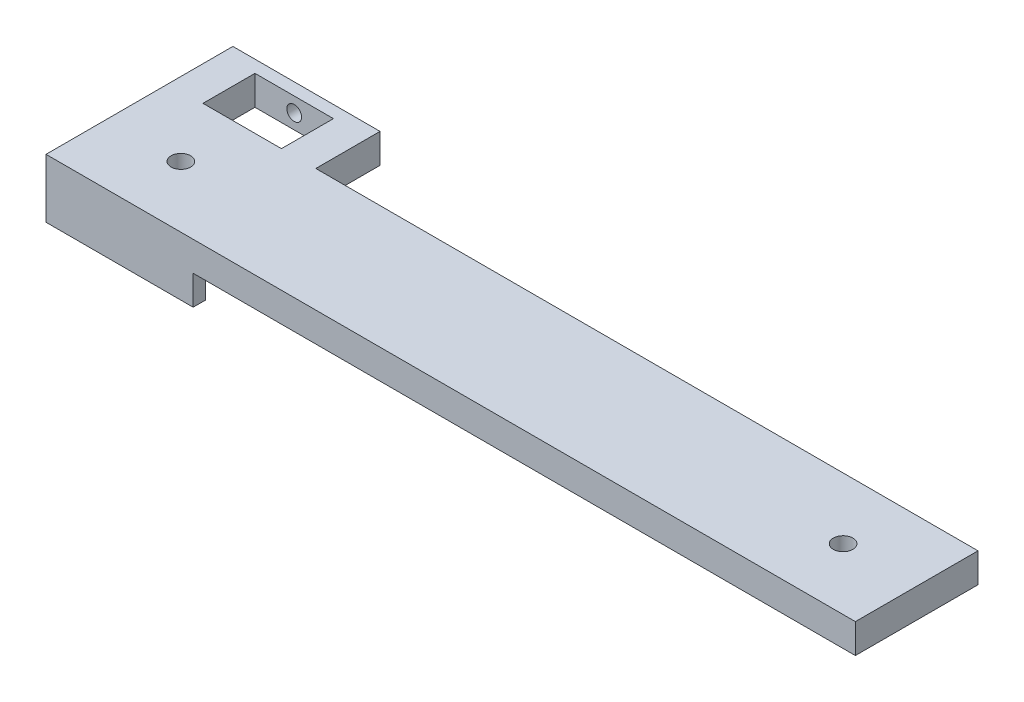
ISO-10303-21;
HEADER;
FILE_DESCRIPTION(('STEP AP214'),'2;1');
FILE_NAME('part.step','',(''),(''),'','','');
FILE_SCHEMA(('AUTOMOTIVE_DESIGN { 1 0 10303 214 1 1 1 1 }'));
ENDSEC;
DATA;
#1=APPLICATION_CONTEXT('core data for automotive mechanical design processes');
#2=APPLICATION_PROTOCOL_DEFINITION('international standard','automotive_design',2000,#1);
#3=PRODUCT_CONTEXT('',#1,'mechanical');
#4=PRODUCT('Part','Part','',(#3));
#5=PRODUCT_RELATED_PRODUCT_CATEGORY('part','',(#4));
#6=PRODUCT_DEFINITION_FORMATION('','',#4);
#7=PRODUCT_DEFINITION_CONTEXT('part definition',#1,'design');
#8=PRODUCT_DEFINITION('design','',#6,#7);
#9=PRODUCT_DEFINITION_SHAPE('','',#8);
#10=(LENGTH_UNIT() NAMED_UNIT(*) SI_UNIT(.MILLI.,.METRE.));
#11=(NAMED_UNIT(*) PLANE_ANGLE_UNIT() SI_UNIT($,.RADIAN.));
#12=(NAMED_UNIT(*) SI_UNIT($,.STERADIAN.) SOLID_ANGLE_UNIT());
#13=UNCERTAINTY_MEASURE_WITH_UNIT(LENGTH_MEASURE(1.E-05),#10,'distance_accuracy_value','');
#14=(GEOMETRIC_REPRESENTATION_CONTEXT(3) GLOBAL_UNCERTAINTY_ASSIGNED_CONTEXT((#13)) GLOBAL_UNIT_ASSIGNED_CONTEXT((#10,
#11,#12)) REPRESENTATION_CONTEXT('',''));
#15=CARTESIAN_POINT('',(0.,0.,0.));
#16=DIRECTION('',(0.,0.,1.));
#17=DIRECTION('',(1.,0.,0.));
#18=AXIS2_PLACEMENT_3D('',#15,#16,#17);
#19=CARTESIAN_POINT('',(0.,-6.,0.));
#20=DIRECTION('',(0.,-1.,0.));
#21=DIRECTION('',(0.,0.,1.));
#22=AXIS2_PLACEMENT_3D('',#19,#20,#21);
#23=PLANE('',#22);
#24=DIRECTION('',(-1.,0.,0.));
#25=VECTOR('',#24,1.);
#26=CARTESIAN_POINT('',(0.,-6.,-2.5));
#27=LINE('',#26,#25);
#28=CARTESIAN_POINT('',(-23.,-6.,-2.5));
#29=VERTEX_POINT('',#28);
#30=CARTESIAN_POINT('',(-30.,-6.,-2.5));
#31=VERTEX_POINT('',#30);
#32=EDGE_CURVE('E193',#29,#31,#27,.T.);
#33=ORIENTED_EDGE('',*,*,#32,.T.);
#34=DIRECTION('',(0.,0.,-1.));
#35=VECTOR('',#34,1.);
#36=CARTESIAN_POINT('',(-30.,-6.,0.));
#37=LINE('',#36,#35);
#38=CARTESIAN_POINT('',(-30.,-6.,-15.6));
#39=VERTEX_POINT('',#38);
#40=EDGE_CURVE('E181',#31,#39,#37,.T.);
#41=ORIENTED_EDGE('',*,*,#40,.T.);
#42=DIRECTION('',(-1.,0.,0.));
#43=VECTOR('',#42,1.);
#44=CARTESIAN_POINT('',(0.,-6.,-15.6));
#45=LINE('',#44,#43);
#46=CARTESIAN_POINT('',(0.,-6.,-15.6));
#47=VERTEX_POINT('',#46);
#48=EDGE_CURVE('E218',#47,#39,#45,.T.);
#49=ORIENTED_EDGE('',*,*,#48,.F.);
#50=DIRECTION('',(0.,0.,1.));
#51=VECTOR('',#50,1.);
#52=CARTESIAN_POINT('',(0.,-6.,0.));
#53=LINE('',#52,#51);
#54=CARTESIAN_POINT('',(0.,-6.,-2.5));
#55=VERTEX_POINT('',#54);
#56=EDGE_CURVE('E234',#47,#55,#53,.T.);
#57=ORIENTED_EDGE('',*,*,#56,.T.);
#58=CARTESIAN_POINT('',(-7.,-6.,-2.5));
#59=VERTEX_POINT('',#58);
#60=EDGE_CURVE('E195',#55,#59,#27,.T.);
#61=ORIENTED_EDGE('',*,*,#60,.T.);
#62=DIRECTION('',(0.,0.,-1.));
#63=VECTOR('',#62,1.);
#64=CARTESIAN_POINT('',(-7.,-6.,0.));
#65=LINE('',#64,#63);
#66=CARTESIAN_POINT('',(-7.,-6.,-13.1));
#67=VERTEX_POINT('',#66);
#68=EDGE_CURVE('E243',#59,#67,#65,.T.);
#69=ORIENTED_EDGE('',*,*,#68,.T.);
#70=DIRECTION('',(1.,0.,0.));
#71=VECTOR('',#70,1.);
#72=CARTESIAN_POINT('',(0.,-6.,-13.1));
#73=LINE('',#72,#71);
#74=CARTESIAN_POINT('',(-23.,-6.,-13.1));
#75=VERTEX_POINT('',#74);
#76=EDGE_CURVE('E240',#75,#67,#73,.T.);
#77=ORIENTED_EDGE('',*,*,#76,.F.);
#78=DIRECTION('',(0.,0.,-1.));
#79=VECTOR('',#78,1.);
#80=CARTESIAN_POINT('',(-23.,-6.,0.));
#81=LINE('',#80,#79);
#82=EDGE_CURVE('E237',#29,#75,#81,.T.);
#83=ORIENTED_EDGE('',*,*,#82,.F.);
#84=EDGE_LOOP('',(#33,#41,#49,#57,#61,#69,#77,#83));
#85=FACE_BOUND('',#84,.T.);
#86=ADVANCED_FACE('F37',(#85),#23,.T.);
#87=CARTESIAN_POINT('',(-23.,-6.,0.));
#88=DIRECTION('',(-1.,0.,0.));
#89=DIRECTION('',(0.,0.,1.));
#90=AXIS2_PLACEMENT_3D('',#87,#88,#89);
#91=PLANE('',#90);
#92=DIRECTION('',(0.,0.,-1.));
#93=VECTOR('',#92,1.);
#94=CARTESIAN_POINT('',(-23.,0.,0.));
#95=LINE('',#94,#93);
#96=CARTESIAN_POINT('',(-23.,0.,-2.5));
#97=VERTEX_POINT('',#96);
#98=CARTESIAN_POINT('',(-23.,0.,-13.1));
#99=VERTEX_POINT('',#98);
#100=EDGE_CURVE('E264',#97,#99,#95,.T.);
#101=ORIENTED_EDGE('',*,*,#100,.F.);
#102=DIRECTION('',(0.,1.,0.));
#103=VECTOR('',#102,1.);
#104=CARTESIAN_POINT('',(-23.,-6.,-2.5));
#105=LINE('',#104,#103);
#106=EDGE_CURVE('E276',#29,#97,#105,.T.);
#107=ORIENTED_EDGE('',*,*,#106,.F.);
#108=ORIENTED_EDGE('',*,*,#82,.T.);
#109=DIRECTION('',(0.,1.,0.));
#110=VECTOR('',#109,1.);
#111=CARTESIAN_POINT('',(-23.,-6.,-13.1));
#112=LINE('',#111,#110);
#113=EDGE_CURVE('E11',#75,#99,#112,.T.);
#114=ORIENTED_EDGE('',*,*,#113,.T.);
#115=EDGE_LOOP('',(#101,#107,#108,#114));
#116=FACE_BOUND('',#115,.T.);
#117=ADVANCED_FACE('F317',(#116),#91,.F.);
#118=CARTESIAN_POINT('',(0.,-6.,-13.1));
#119=DIRECTION('',(0.,0.,-1.));
#120=DIRECTION('',(-1.,0.,0.));
#121=AXIS2_PLACEMENT_3D('',#118,#119,#120);
#122=PLANE('',#121);
#123=CARTESIAN_POINT('',(-15.,-3.,-13.1));
#124=DIRECTION('',(0.,0.,1.));
#125=DIRECTION('',(-1.,0.,0.));
#126=AXIS2_PLACEMENT_3D('',#123,#124,#125);
#127=CIRCLE('',#126,1.5);
#128=CARTESIAN_POINT('',(-16.5,-3.,-13.1));
#129=VERTEX_POINT('',#128);
#130=EDGE_CURVE('E169',#129,#129,#127,.T.);
#131=ORIENTED_EDGE('',*,*,#130,.F.);
#132=EDGE_LOOP('',(#131));
#133=FACE_BOUND('',#132,.T.);
#134=DIRECTION('',(1.,0.,0.));
#135=VECTOR('',#134,1.);
#136=CARTESIAN_POINT('',(0.,0.,-13.1));
#137=LINE('',#136,#135);
#138=CARTESIAN_POINT('',(-7.,0.,-13.1));
#139=VERTEX_POINT('',#138);
#140=EDGE_CURVE('E267',#99,#139,#137,.T.);
#141=ORIENTED_EDGE('',*,*,#140,.F.);
#142=ORIENTED_EDGE('',*,*,#113,.F.);
#143=ORIENTED_EDGE('',*,*,#76,.T.);
#144=DIRECTION('',(0.,1.,0.));
#145=VECTOR('',#144,1.);
#146=CARTESIAN_POINT('',(-7.,-6.,-13.1));
#147=LINE('',#146,#145);
#148=EDGE_CURVE('E46',#67,#139,#147,.T.);
#149=ORIENTED_EDGE('',*,*,#148,.T.);
#150=EDGE_LOOP('',(#141,#142,#143,#149));
#151=FACE_BOUND('',#150,.T.);
#152=ADVANCED_FACE('F324',(#133,#151),#122,.F.);
#153=CARTESIAN_POINT('',(-7.,-6.,0.));
#154=DIRECTION('',(-1.,0.,0.));
#155=DIRECTION('',(0.,0.,1.));
#156=AXIS2_PLACEMENT_3D('',#153,#154,#155);
#157=PLANE('',#156);
#158=DIRECTION('',(0.,0.,-1.));
#159=VECTOR('',#158,1.);
#160=CARTESIAN_POINT('',(-7.,0.,0.));
#161=LINE('',#160,#159);
#162=CARTESIAN_POINT('',(-7.,0.,-2.5));
#163=VERTEX_POINT('',#162);
#164=EDGE_CURVE('E270',#163,#139,#161,.T.);
#165=ORIENTED_EDGE('',*,*,#164,.T.);
#166=ORIENTED_EDGE('',*,*,#148,.F.);
#167=ORIENTED_EDGE('',*,*,#68,.F.);
#168=DIRECTION('',(0.,1.,0.));
#169=VECTOR('',#168,1.);
#170=CARTESIAN_POINT('',(-7.,-6.,-2.5));
#171=LINE('',#170,#169);
#172=EDGE_CURVE('E279',#59,#163,#171,.T.);
#173=ORIENTED_EDGE('',*,*,#172,.T.);
#174=EDGE_LOOP('',(#165,#166,#167,#173));
#175=FACE_BOUND('',#174,.T.);
#176=ADVANCED_FACE('F321',(#175),#157,.T.);
#177=CARTESIAN_POINT('',(0.,-6.,-15.6));
#178=DIRECTION('',(0.,0.,1.));
#179=DIRECTION('',(1.,0.,0.));
#180=AXIS2_PLACEMENT_3D('',#177,#178,#179);
#181=PLANE('',#180);
#182=CARTESIAN_POINT('',(-15.,-3.,-15.6));
#183=DIRECTION('',(0.,0.,1.));
#184=DIRECTION('',(-1.,0.,0.));
#185=AXIS2_PLACEMENT_3D('',#182,#183,#184);
#186=CIRCLE('',#185,1.5);
#187=CARTESIAN_POINT('',(-16.5,-3.,-15.6));
#188=VERTEX_POINT('',#187);
#189=EDGE_CURVE('E417',#188,#188,#186,.T.);
#190=ORIENTED_EDGE('',*,*,#189,.T.);
#191=EDGE_LOOP('',(#190));
#192=FACE_BOUND('',#191,.T.);
#193=DIRECTION('',(-1.,0.,0.));
#194=VECTOR('',#193,1.);
#195=CARTESIAN_POINT('',(0.,0.,-15.6));
#196=LINE('',#195,#194);
#197=CARTESIAN_POINT('',(0.,0.,-15.6));
#198=VERTEX_POINT('',#197);
#199=CARTESIAN_POINT('',(-30.,0.,-15.6));
#200=VERTEX_POINT('',#199);
#201=EDGE_CURVE('E217',#198,#200,#196,.T.);
#202=ORIENTED_EDGE('',*,*,#201,.F.);
#203=DIRECTION('',(0.,1.,0.));
#204=VECTOR('',#203,1.);
#205=CARTESIAN_POINT('',(0.,-6.,-15.6));
#206=LINE('',#205,#204);
#207=EDGE_CURVE('E249',#47,#198,#206,.T.);
#208=ORIENTED_EDGE('',*,*,#207,.F.);
#209=ORIENTED_EDGE('',*,*,#48,.T.);
#210=DIRECTION('',(0.,1.,0.));
#211=VECTOR('',#210,1.);
#212=CARTESIAN_POINT('',(-30.,-6.,-15.6));
#213=LINE('',#212,#211);
#214=EDGE_CURVE('E280',#39,#200,#213,.T.);
#215=ORIENTED_EDGE('',*,*,#214,.T.);
#216=EDGE_LOOP('',(#202,#208,#209,#215));
#217=FACE_BOUND('',#216,.T.);
#218=ADVANCED_FACE('F39',(#192,#217),#181,.F.);
#219=CARTESIAN_POINT('',(-30.,-6.,0.));
#220=DIRECTION('',(-1.,0.,0.));
#221=DIRECTION('',(0.,0.,1.));
#222=AXIS2_PLACEMENT_3D('',#219,#220,#221);
#223=PLANE('',#222);
#224=CARTESIAN_POINT('',(-30.,-6.,20.));
#225=VERTEX_POINT('',#224);
#226=CARTESIAN_POINT('',(-30.,-6.,0.));
#227=VERTEX_POINT('',#226);
#228=EDGE_CURVE('E222',#225,#227,#37,.T.);
#229=ORIENTED_EDGE('',*,*,#228,.F.);
#230=DIRECTION('',(0.,1.,0.));
#231=VECTOR('',#230,1.);
#232=CARTESIAN_POINT('',(-30.,-12.,20.));
#233=LINE('',#232,#231);
#234=CARTESIAN_POINT('',(-30.,-12.,20.));
#235=VERTEX_POINT('',#234);
#236=EDGE_CURVE('E205',#235,#225,#233,.T.);
#237=ORIENTED_EDGE('',*,*,#236,.F.);
#238=DIRECTION('',(0.,0.,-1.));
#239=VECTOR('',#238,1.);
#240=CARTESIAN_POINT('',(-30.,-12.,0.));
#241=LINE('',#240,#239);
#242=CARTESIAN_POINT('',(-30.,-12.,22.5));
#243=VERTEX_POINT('',#242);
#244=EDGE_CURVE('E196',#243,#235,#241,.T.);
#245=ORIENTED_EDGE('',*,*,#244,.F.);
#246=DIRECTION('',(0.,1.,0.));
#247=VECTOR('',#246,1.);
#248=CARTESIAN_POINT('',(-30.,-6.,22.5));
#249=LINE('',#248,#247);
#250=CARTESIAN_POINT('',(-30.,0.,22.5));
#251=VERTEX_POINT('',#250);
#252=EDGE_CURVE('E296',#243,#251,#249,.T.);
#253=ORIENTED_EDGE('',*,*,#252,.T.);
#254=DIRECTION('',(0.,0.,-1.));
#255=VECTOR('',#254,1.);
#256=CARTESIAN_POINT('',(-30.,0.,0.));
#257=LINE('',#256,#255);
#258=EDGE_CURVE('E252',#251,#200,#257,.T.);
#259=ORIENTED_EDGE('',*,*,#258,.T.);
#260=ORIENTED_EDGE('',*,*,#214,.F.);
#261=ORIENTED_EDGE('',*,*,#40,.F.);
#262=DIRECTION('',(0.,1.,0.));
#263=VECTOR('',#262,1.);
#264=CARTESIAN_POINT('',(-30.,-12.,-2.5));
#265=LINE('',#264,#263);
#266=CARTESIAN_POINT('',(-30.,-12.,-2.5));
#267=VERTEX_POINT('',#266);
#268=EDGE_CURVE('E162',#267,#31,#265,.T.);
#269=ORIENTED_EDGE('',*,*,#268,.F.);
#270=DIRECTION('',(0.,0.,-1.));
#271=VECTOR('',#270,1.);
#272=CARTESIAN_POINT('',(-30.,-12.,0.));
#273=LINE('',#272,#271);
#274=CARTESIAN_POINT('',(-30.,-12.,0.));
#275=VERTEX_POINT('',#274);
#276=EDGE_CURVE('E168',#275,#267,#273,.T.);
#277=ORIENTED_EDGE('',*,*,#276,.F.);
#278=DIRECTION('',(0.,1.,0.));
#279=VECTOR('',#278,1.);
#280=CARTESIAN_POINT('',(-30.,-12.,0.));
#281=LINE('',#280,#279);
#282=EDGE_CURVE('E184',#275,#227,#281,.T.);
#283=ORIENTED_EDGE('',*,*,#282,.T.);
#284=EDGE_LOOP('',(#229,#237,#245,#253,#259,#260,#261,#269,#277,#283));
#285=FACE_BOUND('',#284,.T.);
#286=ADVANCED_FACE('F179',(#285),#223,.T.);
#287=CARTESIAN_POINT('',(0.,-6.,22.5));
#288=DIRECTION('',(0.,0.,1.));
#289=DIRECTION('',(1.,0.,0.));
#290=AXIS2_PLACEMENT_3D('',#287,#288,#289);
#291=PLANE('',#290);
#292=DIRECTION('',(-1.,0.,0.));
#293=VECTOR('',#292,1.);
#294=CARTESIAN_POINT('',(0.,-6.,22.5));
#295=LINE('',#294,#293);
#296=CARTESIAN_POINT('',(135.,-6.,22.4999999999999));
#297=VERTEX_POINT('',#296);
#298=CARTESIAN_POINT('',(0.,-6.,22.5));
#299=VERTEX_POINT('',#298);
#300=EDGE_CURVE('E225',#297,#299,#295,.T.);
#301=ORIENTED_EDGE('',*,*,#300,.F.);
#302=DIRECTION('',(0.,1.,0.));
#303=VECTOR('',#302,1.);
#304=CARTESIAN_POINT('',(135.,-6.,22.4999999999999));
#305=LINE('',#304,#303);
#306=CARTESIAN_POINT('',(135.,0.,22.4999999999999));
#307=VERTEX_POINT('',#306);
#308=EDGE_CURVE('E293',#297,#307,#305,.T.);
#309=ORIENTED_EDGE('',*,*,#308,.T.);
#310=DIRECTION('',(-1.,0.,0.));
#311=VECTOR('',#310,1.);
#312=CARTESIAN_POINT('',(0.,0.,22.5));
#313=LINE('',#312,#311);
#314=EDGE_CURVE('E254',#307,#251,#313,.T.);
#315=ORIENTED_EDGE('',*,*,#314,.T.);
#316=ORIENTED_EDGE('',*,*,#252,.F.);
#317=DIRECTION('',(-1.,0.,0.));
#318=VECTOR('',#317,1.);
#319=CARTESIAN_POINT('',(0.,-12.,22.5));
#320=LINE('',#319,#318);
#321=CARTESIAN_POINT('',(0.,-12.,22.5));
#322=VERTEX_POINT('',#321);
#323=EDGE_CURVE('E199',#322,#243,#320,.T.);
#324=ORIENTED_EDGE('',*,*,#323,.F.);
#325=DIRECTION('',(0.,1.,0.));
#326=VECTOR('',#325,1.);
#327=CARTESIAN_POINT('',(0.,-12.,22.5));
#328=LINE('',#327,#326);
#329=EDGE_CURVE('E209',#322,#299,#328,.T.);
#330=ORIENTED_EDGE('',*,*,#329,.T.);
#331=EDGE_LOOP('',(#301,#309,#315,#316,#324,#330));
#332=FACE_BOUND('',#331,.T.);
#333=ADVANCED_FACE('F373',(#332),#291,.T.);
#334=CARTESIAN_POINT('',(135.,-6.,0.));
#335=DIRECTION('',(-1.,0.,0.));
#336=DIRECTION('',(0.,0.,1.));
#337=AXIS2_PLACEMENT_3D('',#334,#335,#336);
#338=PLANE('',#337);
#339=DIRECTION('',(0.,0.,-1.));
#340=VECTOR('',#339,1.);
#341=CARTESIAN_POINT('',(135.,0.,0.));
#342=LINE('',#341,#340);
#343=CARTESIAN_POINT('',(135.,0.,-2.50000000000008));
#344=VERTEX_POINT('',#343);
#345=EDGE_CURVE('E256',#307,#344,#342,.T.);
#346=ORIENTED_EDGE('',*,*,#345,.F.);
#347=ORIENTED_EDGE('',*,*,#308,.F.);
#348=DIRECTION('',(0.,0.,-1.));
#349=VECTOR('',#348,1.);
#350=CARTESIAN_POINT('',(135.,-6.,0.));
#351=LINE('',#350,#349);
#352=CARTESIAN_POINT('',(135.,-6.,-2.50000000000008));
#353=VERTEX_POINT('',#352);
#354=EDGE_CURVE('E228',#297,#353,#351,.T.);
#355=ORIENTED_EDGE('',*,*,#354,.T.);
#356=DIRECTION('',(0.,1.,0.));
#357=VECTOR('',#356,1.);
#358=CARTESIAN_POINT('',(135.,-6.,-2.50000000000008));
#359=LINE('',#358,#357);
#360=EDGE_CURVE('E290',#353,#344,#359,.T.);
#361=ORIENTED_EDGE('',*,*,#360,.T.);
#362=EDGE_LOOP('',(#346,#347,#355,#361));
#363=FACE_BOUND('',#362,.T.);
#364=ADVANCED_FACE('F376',(#363),#338,.F.);
#365=CARTESIAN_POINT('',(0.,-6.,-2.5));
#366=DIRECTION('',(0.,0.,1.));
#367=DIRECTION('',(1.,0.,0.));
#368=AXIS2_PLACEMENT_3D('',#365,#366,#367);
#369=PLANE('',#368);
#370=DIRECTION('',(-1.,0.,0.));
#371=VECTOR('',#370,1.);
#372=CARTESIAN_POINT('',(0.,0.,-2.5));
#373=LINE('',#372,#371);
#374=CARTESIAN_POINT('',(0.,0.,-2.5));
#375=VERTEX_POINT('',#374);
#376=EDGE_CURVE('E259',#344,#375,#373,.T.);
#377=ORIENTED_EDGE('',*,*,#376,.F.);
#378=ORIENTED_EDGE('',*,*,#360,.F.);
#379=DIRECTION('',(-1.,0.,0.));
#380=VECTOR('',#379,1.);
#381=CARTESIAN_POINT('',(0.,-6.,-2.5));
#382=LINE('',#381,#380);
#383=EDGE_CURVE('E231',#353,#55,#382,.T.);
#384=ORIENTED_EDGE('',*,*,#383,.T.);
#385=DIRECTION('',(0.,1.,0.));
#386=VECTOR('',#385,1.);
#387=CARTESIAN_POINT('',(0.,-6.,-2.5));
#388=LINE('',#387,#386);
#389=EDGE_CURVE('E287',#55,#375,#388,.T.);
#390=ORIENTED_EDGE('',*,*,#389,.T.);
#391=EDGE_LOOP('',(#377,#378,#384,#390));
#392=FACE_BOUND('',#391,.T.);
#393=ADVANCED_FACE('F379',(#392),#369,.F.);
#394=CARTESIAN_POINT('',(0.,-6.,-2.5));
#395=DIRECTION('',(0.,0.,-1.));
#396=DIRECTION('',(-1.,0.,0.));
#397=AXIS2_PLACEMENT_3D('',#394,#395,#396);
#398=PLANE('',#397);
#399=CARTESIAN_POINT('',(-15.,-3.,-2.5));
#400=DIRECTION('',(0.,0.,1.));
#401=DIRECTION('',(-1.,0.,0.));
#402=AXIS2_PLACEMENT_3D('',#399,#400,#401);
#403=CIRCLE('',#402,1.5);
#404=CARTESIAN_POINT('',(-16.5,-3.,-2.5));
#405=VERTEX_POINT('',#404);
#406=EDGE_CURVE('E41',#405,#405,#403,.T.);
#407=ORIENTED_EDGE('',*,*,#406,.T.);
#408=EDGE_LOOP('',(#407));
#409=FACE_BOUND('',#408,.T.);
#410=DIRECTION('',(1.,0.,0.));
#411=VECTOR('',#410,1.);
#412=CARTESIAN_POINT('',(0.,0.,-2.5));
#413=LINE('',#412,#411);
#414=EDGE_CURVE('E272',#97,#163,#413,.T.);
#415=ORIENTED_EDGE('',*,*,#414,.T.);
#416=ORIENTED_EDGE('',*,*,#172,.F.);
#417=ORIENTED_EDGE('',*,*,#60,.F.);
#418=DIRECTION('',(0.,1.,0.));
#419=VECTOR('',#418,1.);
#420=CARTESIAN_POINT('',(0.,-12.,-2.5));
#421=LINE('',#420,#419);
#422=CARTESIAN_POINT('',(0.,-12.,-2.5));
#423=VERTEX_POINT('',#422);
#424=EDGE_CURVE('E166',#423,#55,#421,.T.);
#425=ORIENTED_EDGE('',*,*,#424,.F.);
#426=DIRECTION('',(1.,0.,0.));
#427=VECTOR('',#426,1.);
#428=CARTESIAN_POINT('',(0.,-12.,-2.5));
#429=LINE('',#428,#427);
#430=EDGE_CURVE('E157',#267,#423,#429,.T.);
#431=ORIENTED_EDGE('',*,*,#430,.F.);
#432=ORIENTED_EDGE('',*,*,#268,.T.);
#433=ORIENTED_EDGE('',*,*,#32,.F.);
#434=ORIENTED_EDGE('',*,*,#106,.T.);
#435=EDGE_LOOP('',(#415,#416,#417,#425,#431,#432,#433,#434));
#436=FACE_BOUND('',#435,.T.);
#437=ADVANCED_FACE('F159',(#409,#436),#398,.T.);
#438=CARTESIAN_POINT('',(0.,-6.,0.));
#439=DIRECTION('',(1.,0.,0.));
#440=DIRECTION('',(0.,0.,-1.));
#441=AXIS2_PLACEMENT_3D('',#438,#439,#440);
#442=PLANE('',#441);
#443=DIRECTION('',(0.,0.,1.));
#444=VECTOR('',#443,1.);
#445=CARTESIAN_POINT('',(0.,0.,0.));
#446=LINE('',#445,#444);
#447=EDGE_CURVE('E262',#198,#375,#446,.T.);
#448=ORIENTED_EDGE('',*,*,#447,.T.);
#449=ORIENTED_EDGE('',*,*,#389,.F.);
#450=ORIENTED_EDGE('',*,*,#56,.F.);
#451=ORIENTED_EDGE('',*,*,#207,.T.);
#452=EDGE_LOOP('',(#448,#449,#450,#451));
#453=FACE_BOUND('',#452,.T.);
#454=ADVANCED_FACE('F310',(#453),#442,.T.);
#455=CARTESIAN_POINT('',(120.,-6.,10.));
#456=DIRECTION('',(0.,1.,0.));
#457=DIRECTION('',(0.,0.,-1.));
#458=AXIS2_PLACEMENT_3D('',#455,#456,#457);
#459=CYLINDRICAL_SURFACE('',#458,2.);
#460=CARTESIAN_POINT('',(120.,-6.,10.));
#461=DIRECTION('',(0.,1.,0.));
#462=DIRECTION('',(0.,0.,1.));
#463=AXIS2_PLACEMENT_3D('',#460,#461,#462);
#464=CIRCLE('',#463,2.);
#465=CARTESIAN_POINT('',(120.,-6.,12.));
#466=VERTEX_POINT('',#465);
#467=EDGE_CURVE('E246',#466,#466,#464,.F.);
#468=ORIENTED_EDGE('',*,*,#467,.T.);
#469=EDGE_LOOP('',(#468));
#470=FACE_BOUND('',#469,.T.);
#471=CARTESIAN_POINT('',(120.,0.,10.));
#472=DIRECTION('',(0.,1.,0.));
#473=DIRECTION('',(0.,0.,1.));
#474=AXIS2_PLACEMENT_3D('',#471,#472,#473);
#475=CIRCLE('',#474,2.);
#476=CARTESIAN_POINT('',(120.,0.,12.));
#477=VERTEX_POINT('',#476);
#478=EDGE_CURVE('E221',#477,#477,#475,.F.);
#479=ORIENTED_EDGE('',*,*,#478,.F.);
#480=EDGE_LOOP('',(#479));
#481=FACE_BOUND('',#480,.T.);
#482=ADVANCED_FACE('F343',(#470,#481),#459,.F.);
#483=CARTESIAN_POINT('',(-15.,-6.,10.));
#484=DIRECTION('',(0.,1.,0.));
#485=DIRECTION('',(0.,0.,1.));
#486=AXIS2_PLACEMENT_3D('',#483,#484,#485);
#487=CIRCLE('',#486,2.);
#488=CARTESIAN_POINT('',(-15.,-6.,12.));
#489=VERTEX_POINT('',#488);
#490=EDGE_CURVE('E356',#489,#489,#487,.T.);
#491=ORIENTED_EDGE('',*,*,#490,.T.);
#492=EDGE_LOOP('',(#491));
#493=FACE_BOUND('',#492,.T.);
#494=DIRECTION('',(1.,0.,0.));
#495=VECTOR('',#494,1.);
#496=CARTESIAN_POINT('',(0.,-6.,0.));
#497=LINE('',#496,#495);
#498=CARTESIAN_POINT('',(0.,-6.,0.));
#499=VERTEX_POINT('',#498);
#500=EDGE_CURVE('E186',#227,#499,#497,.T.);
#501=ORIENTED_EDGE('',*,*,#500,.T.);
#502=DIRECTION('',(0.,0.,1.));
#503=VECTOR('',#502,1.);
#504=CARTESIAN_POINT('',(0.,-6.,0.));
#505=LINE('',#504,#503);
#506=EDGE_CURVE('E183',#55,#499,#505,.T.);
#507=ORIENTED_EDGE('',*,*,#506,.F.);
#508=ORIENTED_EDGE('',*,*,#383,.F.);
#509=ORIENTED_EDGE('',*,*,#354,.F.);
#510=ORIENTED_EDGE('',*,*,#300,.T.);
#511=DIRECTION('',(0.,0.,-1.));
#512=VECTOR('',#511,1.);
#513=CARTESIAN_POINT('',(0.,-6.,0.));
#514=LINE('',#513,#512);
#515=CARTESIAN_POINT('',(0.,-6.,20.));
#516=VERTEX_POINT('',#515);
#517=EDGE_CURVE('E214',#299,#516,#514,.T.);
#518=ORIENTED_EDGE('',*,*,#517,.T.);
#519=DIRECTION('',(1.,0.,0.));
#520=VECTOR('',#519,1.);
#521=CARTESIAN_POINT('',(0.,-6.,20.));
#522=LINE('',#521,#520);
#523=EDGE_CURVE('E212',#225,#516,#522,.T.);
#524=ORIENTED_EDGE('',*,*,#523,.F.);
#525=ORIENTED_EDGE('',*,*,#228,.T.);
#526=EDGE_LOOP('',(#501,#507,#508,#509,#510,#518,#524,#525));
#527=FACE_BOUND('',#526,.T.);
#528=ORIENTED_EDGE('',*,*,#467,.F.);
#529=EDGE_LOOP('',(#528));
#530=FACE_BOUND('',#529,.T.);
#531=ADVANCED_FACE('F337',(#493,#527,#530),#23,.T.);
#532=CARTESIAN_POINT('',(0.,0.,0.));
#533=DIRECTION('',(0.,-1.,0.));
#534=DIRECTION('',(0.,0.,1.));
#535=AXIS2_PLACEMENT_3D('',#532,#533,#534);
#536=PLANE('',#535);
#537=CARTESIAN_POINT('',(-15.,0.,10.));
#538=DIRECTION('',(0.,1.,0.));
#539=DIRECTION('',(0.,0.,1.));
#540=AXIS2_PLACEMENT_3D('',#537,#538,#539);
#541=CIRCLE('',#540,2.);
#542=CARTESIAN_POINT('',(-15.,0.,12.));
#543=VERTEX_POINT('',#542);
#544=EDGE_CURVE('E415',#543,#543,#541,.T.);
#545=ORIENTED_EDGE('',*,*,#544,.F.);
#546=EDGE_LOOP('',(#545));
#547=FACE_BOUND('',#546,.T.);
#548=ORIENTED_EDGE('',*,*,#414,.F.);
#549=ORIENTED_EDGE('',*,*,#100,.T.);
#550=ORIENTED_EDGE('',*,*,#140,.T.);
#551=ORIENTED_EDGE('',*,*,#164,.F.);
#552=EDGE_LOOP('',(#548,#549,#550,#551));
#553=FACE_BOUND('',#552,.T.);
#554=ORIENTED_EDGE('',*,*,#258,.F.);
#555=ORIENTED_EDGE('',*,*,#314,.F.);
#556=ORIENTED_EDGE('',*,*,#345,.T.);
#557=ORIENTED_EDGE('',*,*,#376,.T.);
#558=ORIENTED_EDGE('',*,*,#447,.F.);
#559=ORIENTED_EDGE('',*,*,#201,.T.);
#560=EDGE_LOOP('',(#554,#555,#556,#557,#558,#559));
#561=FACE_BOUND('',#560,.T.);
#562=ORIENTED_EDGE('',*,*,#478,.T.);
#563=EDGE_LOOP('',(#562));
#564=FACE_BOUND('',#563,.T.);
#565=ADVANCED_FACE('F304',(#547,#553,#561,#564),#536,.F.);
#566=CARTESIAN_POINT('',(0.,-12.,0.));
#567=DIRECTION('',(1.,0.,0.));
#568=DIRECTION('',(0.,0.,-1.));
#569=AXIS2_PLACEMENT_3D('',#566,#567,#568);
#570=PLANE('',#569);
#571=ORIENTED_EDGE('',*,*,#329,.F.);
#572=DIRECTION('',(0.,0.,1.));
#573=VECTOR('',#572,1.);
#574=CARTESIAN_POINT('',(0.,-12.,0.));
#575=LINE('',#574,#573);
#576=CARTESIAN_POINT('',(0.,-12.,20.));
#577=VERTEX_POINT('',#576);
#578=EDGE_CURVE('E201',#577,#322,#575,.T.);
#579=ORIENTED_EDGE('',*,*,#578,.F.);
#580=DIRECTION('',(0.,1.,0.));
#581=VECTOR('',#580,1.);
#582=CARTESIAN_POINT('',(0.,-12.,20.));
#583=LINE('',#582,#581);
#584=EDGE_CURVE('E62',#577,#516,#583,.T.);
#585=ORIENTED_EDGE('',*,*,#584,.T.);
#586=ORIENTED_EDGE('',*,*,#517,.F.);
#587=EDGE_LOOP('',(#571,#579,#585,#586));
#588=FACE_BOUND('',#587,.T.);
#589=ADVANCED_FACE('F349',(#588),#570,.T.);
#590=CARTESIAN_POINT('',(0.,-12.,20.));
#591=DIRECTION('',(0.,0.,1.));
#592=DIRECTION('',(1.,0.,0.));
#593=AXIS2_PLACEMENT_3D('',#590,#591,#592);
#594=PLANE('',#593);
#595=ORIENTED_EDGE('',*,*,#523,.T.);
#596=ORIENTED_EDGE('',*,*,#584,.F.);
#597=DIRECTION('',(-1.,0.,0.));
#598=VECTOR('',#597,1.);
#599=CARTESIAN_POINT('',(0.,-12.,20.));
#600=LINE('',#599,#598);
#601=EDGE_CURVE('E203',#577,#235,#600,.T.);
#602=ORIENTED_EDGE('',*,*,#601,.T.);
#603=ORIENTED_EDGE('',*,*,#236,.T.);
#604=EDGE_LOOP('',(#595,#596,#602,#603));
#605=FACE_BOUND('',#604,.T.);
#606=ADVANCED_FACE('F365',(#605),#594,.F.);
#607=CARTESIAN_POINT('',(0.,-12.,0.));
#608=DIRECTION('',(0.,-1.,0.));
#609=DIRECTION('',(0.,0.,1.));
#610=AXIS2_PLACEMENT_3D('',#607,#608,#609);
#611=PLANE('',#610);
#612=ORIENTED_EDGE('',*,*,#244,.T.);
#613=ORIENTED_EDGE('',*,*,#601,.F.);
#614=ORIENTED_EDGE('',*,*,#578,.T.);
#615=ORIENTED_EDGE('',*,*,#323,.T.);
#616=EDGE_LOOP('',(#612,#613,#614,#615));
#617=FACE_BOUND('',#616,.T.);
#618=ADVANCED_FACE('F367',(#617),#611,.T.);
#619=CARTESIAN_POINT('',(0.,-12.,0.));
#620=DIRECTION('',(0.,0.,1.));
#621=DIRECTION('',(1.,0.,0.));
#622=AXIS2_PLACEMENT_3D('',#619,#620,#621);
#623=PLANE('',#622);
#624=ORIENTED_EDGE('',*,*,#282,.F.);
#625=DIRECTION('',(-1.,0.,0.));
#626=VECTOR('',#625,1.);
#627=CARTESIAN_POINT('',(0.,-12.,0.));
#628=LINE('',#627,#626);
#629=CARTESIAN_POINT('',(0.,-12.,0.));
#630=VERTEX_POINT('',#629);
#631=EDGE_CURVE('E173',#630,#275,#628,.T.);
#632=ORIENTED_EDGE('',*,*,#631,.F.);
#633=DIRECTION('',(0.,1.,0.));
#634=VECTOR('',#633,1.);
#635=CARTESIAN_POINT('',(0.,-12.,0.));
#636=LINE('',#635,#634);
#637=EDGE_CURVE('E54',#630,#499,#636,.T.);
#638=ORIENTED_EDGE('',*,*,#637,.T.);
#639=ORIENTED_EDGE('',*,*,#500,.F.);
#640=EDGE_LOOP('',(#624,#632,#638,#639));
#641=FACE_BOUND('',#640,.T.);
#642=ADVANCED_FACE('F361',(#641),#623,.T.);
#643=CARTESIAN_POINT('',(0.,-12.,0.));
#644=DIRECTION('',(-1.,0.,0.));
#645=DIRECTION('',(0.,0.,1.));
#646=AXIS2_PLACEMENT_3D('',#643,#644,#645);
#647=PLANE('',#646);
#648=ORIENTED_EDGE('',*,*,#506,.T.);
#649=ORIENTED_EDGE('',*,*,#637,.F.);
#650=DIRECTION('',(0.,0.,-1.));
#651=VECTOR('',#650,1.);
#652=CARTESIAN_POINT('',(0.,-12.,0.));
#653=LINE('',#652,#651);
#654=EDGE_CURVE('E428',#630,#423,#653,.T.);
#655=ORIENTED_EDGE('',*,*,#654,.T.);
#656=ORIENTED_EDGE('',*,*,#424,.T.);
#657=EDGE_LOOP('',(#648,#649,#655,#656));
#658=FACE_BOUND('',#657,.T.);
#659=ADVANCED_FACE('F390',(#658),#647,.F.);
#660=CARTESIAN_POINT('',(0.,-12.,0.));
#661=DIRECTION('',(0.,-1.,0.));
#662=DIRECTION('',(0.,0.,1.));
#663=AXIS2_PLACEMENT_3D('',#660,#661,#662);
#664=PLANE('',#663);
#665=ORIENTED_EDGE('',*,*,#430,.T.);
#666=ORIENTED_EDGE('',*,*,#654,.F.);
#667=ORIENTED_EDGE('',*,*,#631,.T.);
#668=ORIENTED_EDGE('',*,*,#276,.T.);
#669=EDGE_LOOP('',(#665,#666,#667,#668));
#670=FACE_BOUND('',#669,.T.);
#671=ADVANCED_FACE('F172',(#670),#664,.T.);
#672=CARTESIAN_POINT('',(-15.,-3.,-0.100000000000003));
#673=DIRECTION('',(0.,0.,-1.));
#674=DIRECTION('',(-1.,0.,0.));
#675=AXIS2_PLACEMENT_3D('',#672,#673,#674);
#676=PLANE('',#675);
#677=CARTESIAN_POINT('',(-15.,-3.,-0.100000000000003));
#678=DIRECTION('',(0.,0.,1.));
#679=DIRECTION('',(-1.,0.,0.));
#680=AXIS2_PLACEMENT_3D('',#677,#678,#679);
#681=CIRCLE('',#680,1.5);
#682=CARTESIAN_POINT('',(-16.5,-3.,-0.100000000000003));
#683=VERTEX_POINT('',#682);
#684=EDGE_CURVE('E420',#683,#683,#681,.T.);
#685=ORIENTED_EDGE('',*,*,#684,.F.);
#686=EDGE_LOOP('',(#685));
#687=FACE_BOUND('',#686,.T.);
#688=ADVANCED_FACE('F396',(#687),#676,.T.);
#689=CARTESIAN_POINT('',(-15.,-3.,-0.100000000000003));
#690=DIRECTION('',(0.,0.,-1.));
#691=DIRECTION('',(-1.,0.,0.));
#692=AXIS2_PLACEMENT_3D('',#689,#690,#691);
#693=CYLINDRICAL_SURFACE('',#692,1.5);
#694=ORIENTED_EDGE('',*,*,#406,.F.);
#695=EDGE_LOOP('',(#694));
#696=FACE_BOUND('',#695,.T.);
#697=ORIENTED_EDGE('',*,*,#684,.T.);
#698=EDGE_LOOP('',(#697));
#699=FACE_BOUND('',#698,.T.);
#700=ADVANCED_FACE('F397',(#696,#699),#693,.F.);
#701=ORIENTED_EDGE('',*,*,#189,.F.);
#702=EDGE_LOOP('',(#701));
#703=FACE_BOUND('',#702,.T.);
#704=ORIENTED_EDGE('',*,*,#130,.T.);
#705=EDGE_LOOP('',(#704));
#706=FACE_BOUND('',#705,.T.);
#707=ADVANCED_FACE('F400',(#703,#706),#693,.F.);
#708=CARTESIAN_POINT('',(-15.,0.,10.));
#709=DIRECTION('',(0.,-1.,0.));
#710=DIRECTION('',(0.,0.,1.));
#711=AXIS2_PLACEMENT_3D('',#708,#709,#710);
#712=CYLINDRICAL_SURFACE('',#711,2.);
#713=ORIENTED_EDGE('',*,*,#544,.T.);
#714=EDGE_LOOP('',(#713));
#715=FACE_BOUND('',#714,.T.);
#716=ORIENTED_EDGE('',*,*,#490,.F.);
#717=EDGE_LOOP('',(#716));
#718=FACE_BOUND('',#717,.T.);
#719=ADVANCED_FACE('F405',(#715,#718),#712,.F.);
#720=CLOSED_SHELL('',(#86,#117,#152,#176,#218,#286,#333,#364,#393,#437,#454,#482,#531,#565,#589,
#606,#618,#642,#659,#671,#688,#700,#707,#719));
#721=MANIFOLD_SOLID_BREP('B2',#720);
#722=ADVANCED_BREP_SHAPE_REPRESENTATION('',(#18,#721),#14);
#723=SHAPE_DEFINITION_REPRESENTATION(#9,#722);
ENDSEC;
END-ISO-10303-21;
